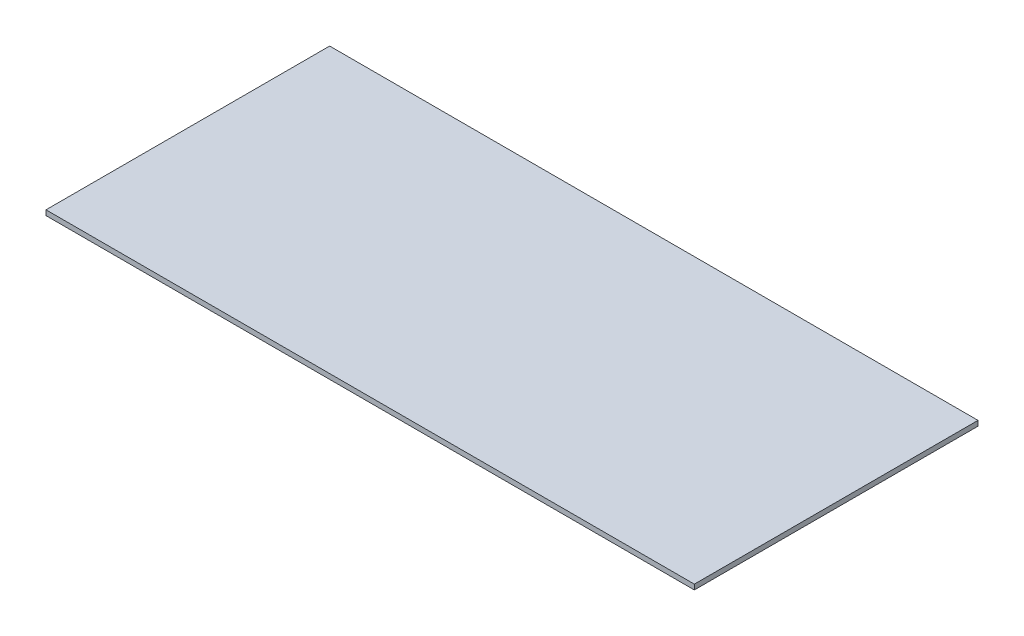
ISO-10303-21;
HEADER;
FILE_DESCRIPTION(('STEP AP214'),'2;1');
FILE_NAME('part.step','',(''),(''),'','','');
FILE_SCHEMA(('AUTOMOTIVE_DESIGN { 1 0 10303 214 1 1 1 1 }'));
ENDSEC;
DATA;
#1=APPLICATION_CONTEXT('core data for automotive mechanical design processes');
#2=APPLICATION_PROTOCOL_DEFINITION('international standard','automotive_design',2000,#1);
#3=PRODUCT_CONTEXT('',#1,'mechanical');
#4=PRODUCT('Part','Part','',(#3));
#5=PRODUCT_RELATED_PRODUCT_CATEGORY('part','',(#4));
#6=PRODUCT_DEFINITION_FORMATION('','',#4);
#7=PRODUCT_DEFINITION_CONTEXT('part definition',#1,'design');
#8=PRODUCT_DEFINITION('design','',#6,#7);
#9=PRODUCT_DEFINITION_SHAPE('','',#8);
#10=(LENGTH_UNIT() NAMED_UNIT(*) SI_UNIT(.MILLI.,.METRE.));
#11=(NAMED_UNIT(*) PLANE_ANGLE_UNIT() SI_UNIT($,.RADIAN.));
#12=(NAMED_UNIT(*) SI_UNIT($,.STERADIAN.) SOLID_ANGLE_UNIT());
#13=UNCERTAINTY_MEASURE_WITH_UNIT(LENGTH_MEASURE(1.E-05),#10,'distance_accuracy_value','');
#14=(GEOMETRIC_REPRESENTATION_CONTEXT(3) GLOBAL_UNCERTAINTY_ASSIGNED_CONTEXT((#13)) GLOBAL_UNIT_ASSIGNED_CONTEXT((#10,
#11,#12)) REPRESENTATION_CONTEXT('',''));
#15=CARTESIAN_POINT('',(0.,0.,0.));
#16=DIRECTION('',(0.,0.,1.));
#17=DIRECTION('',(1.,0.,0.));
#18=AXIS2_PLACEMENT_3D('',#15,#16,#17);
#19=CARTESIAN_POINT('',(101.6,1.5875,44.45));
#20=DIRECTION('',(-1.,0.,0.));
#21=DIRECTION('',(0.,0.,1.));
#22=AXIS2_PLACEMENT_3D('',#19,#20,#21);
#23=PLANE('',#22);
#24=DIRECTION('',(0.,0.,-1.));
#25=VECTOR('',#24,1.);
#26=CARTESIAN_POINT('',(101.6,0.,44.45));
#27=LINE('',#26,#25);
#28=CARTESIAN_POINT('',(101.6,0.,44.45));
#29=VERTEX_POINT('',#28);
#30=CARTESIAN_POINT('',(101.6,0.,-44.45));
#31=VERTEX_POINT('',#30);
#32=EDGE_CURVE('E128',#29,#31,#27,.T.);
#33=ORIENTED_EDGE('',*,*,#32,.T.);
#34=DIRECTION('',(0.,-1.,0.));
#35=VECTOR('',#34,1.);
#36=CARTESIAN_POINT('',(101.6,1.5875,-44.45));
#37=LINE('',#36,#35);
#38=CARTESIAN_POINT('',(101.6,1.5875,-44.45));
#39=VERTEX_POINT('',#38);
#40=EDGE_CURVE('E12',#39,#31,#37,.T.);
#41=ORIENTED_EDGE('',*,*,#40,.F.);
#42=DIRECTION('',(0.,0.,-1.));
#43=VECTOR('',#42,1.);
#44=CARTESIAN_POINT('',(101.6,1.5875,44.45));
#45=LINE('',#44,#43);
#46=CARTESIAN_POINT('',(101.6,1.5875,44.45));
#47=VERTEX_POINT('',#46);
#48=EDGE_CURVE('E92',#47,#39,#45,.T.);
#49=ORIENTED_EDGE('',*,*,#48,.F.);
#50=DIRECTION('',(0.,-1.,0.));
#51=VECTOR('',#50,1.);
#52=CARTESIAN_POINT('',(101.6,1.5875,44.45));
#53=LINE('',#52,#51);
#54=EDGE_CURVE('E104',#47,#29,#53,.T.);
#55=ORIENTED_EDGE('',*,*,#54,.T.);
#56=EDGE_LOOP('',(#33,#41,#49,#55));
#57=FACE_BOUND('',#56,.T.);
#58=ADVANCED_FACE('F40',(#57),#23,.F.);
#59=CARTESIAN_POINT('',(-101.6,1.5875,-44.45));
#60=DIRECTION('',(0.,0.,1.));
#61=DIRECTION('',(1.,0.,0.));
#62=AXIS2_PLACEMENT_3D('',#59,#60,#61);
#63=PLANE('',#62);
#64=DIRECTION('',(-1.,0.,0.));
#65=VECTOR('',#64,1.);
#66=CARTESIAN_POINT('',(-101.6,0.,-44.45));
#67=LINE('',#66,#65);
#68=CARTESIAN_POINT('',(-101.6,0.,-44.45));
#69=VERTEX_POINT('',#68);
#70=EDGE_CURVE('E97',#31,#69,#67,.T.);
#71=ORIENTED_EDGE('',*,*,#70,.T.);
#72=DIRECTION('',(0.,-1.,0.));
#73=VECTOR('',#72,1.);
#74=CARTESIAN_POINT('',(-101.6,1.5875,-44.45));
#75=LINE('',#74,#73);
#76=CARTESIAN_POINT('',(-101.6,1.5875,-44.45));
#77=VERTEX_POINT('',#76);
#78=EDGE_CURVE('E49',#77,#69,#75,.T.);
#79=ORIENTED_EDGE('',*,*,#78,.F.);
#80=DIRECTION('',(-1.,0.,0.));
#81=VECTOR('',#80,1.);
#82=CARTESIAN_POINT('',(-101.6,1.5875,-44.45));
#83=LINE('',#82,#81);
#84=EDGE_CURVE('E87',#39,#77,#83,.T.);
#85=ORIENTED_EDGE('',*,*,#84,.F.);
#86=ORIENTED_EDGE('',*,*,#40,.T.);
#87=EDGE_LOOP('',(#71,#79,#85,#86));
#88=FACE_BOUND('',#87,.T.);
#89=ADVANCED_FACE('F96',(#88),#63,.F.);
#90=CARTESIAN_POINT('',(-101.6,1.5875,44.45));
#91=DIRECTION('',(1.,0.,0.));
#92=DIRECTION('',(0.,0.,-1.));
#93=AXIS2_PLACEMENT_3D('',#90,#91,#92);
#94=PLANE('',#93);
#95=DIRECTION('',(0.,0.,1.));
#96=VECTOR('',#95,1.);
#97=CARTESIAN_POINT('',(-101.6,0.,44.45));
#98=LINE('',#97,#96);
#99=CARTESIAN_POINT('',(-101.6,0.,44.45));
#100=VERTEX_POINT('',#99);
#101=EDGE_CURVE('E74',#69,#100,#98,.T.);
#102=ORIENTED_EDGE('',*,*,#101,.T.);
#103=DIRECTION('',(0.,-1.,0.));
#104=VECTOR('',#103,1.);
#105=CARTESIAN_POINT('',(-101.6,1.5875,44.45));
#106=LINE('',#105,#104);
#107=CARTESIAN_POINT('',(-101.6,1.5875,44.45));
#108=VERTEX_POINT('',#107);
#109=EDGE_CURVE('E99',#108,#100,#106,.T.);
#110=ORIENTED_EDGE('',*,*,#109,.F.);
#111=DIRECTION('',(0.,0.,1.));
#112=VECTOR('',#111,1.);
#113=CARTESIAN_POINT('',(-101.6,1.5875,44.45));
#114=LINE('',#113,#112);
#115=EDGE_CURVE('E90',#77,#108,#114,.T.);
#116=ORIENTED_EDGE('',*,*,#115,.F.);
#117=ORIENTED_EDGE('',*,*,#78,.T.);
#118=EDGE_LOOP('',(#102,#110,#116,#117));
#119=FACE_BOUND('',#118,.T.);
#120=ADVANCED_FACE('F100',(#119),#94,.F.);
#121=CARTESIAN_POINT('',(-101.6,1.5875,44.45));
#122=DIRECTION('',(0.,0.,-1.));
#123=DIRECTION('',(-1.,0.,0.));
#124=AXIS2_PLACEMENT_3D('',#121,#122,#123);
#125=PLANE('',#124);
#126=DIRECTION('',(1.,0.,0.));
#127=VECTOR('',#126,1.);
#128=CARTESIAN_POINT('',(-101.6,0.,44.45));
#129=LINE('',#128,#127);
#130=EDGE_CURVE('E80',#100,#29,#129,.T.);
#131=ORIENTED_EDGE('',*,*,#130,.T.);
#132=ORIENTED_EDGE('',*,*,#54,.F.);
#133=DIRECTION('',(1.,0.,0.));
#134=VECTOR('',#133,1.);
#135=CARTESIAN_POINT('',(-101.6,1.5875,44.45));
#136=LINE('',#135,#134);
#137=EDGE_CURVE('E57',#108,#47,#136,.T.);
#138=ORIENTED_EDGE('',*,*,#137,.F.);
#139=ORIENTED_EDGE('',*,*,#109,.T.);
#140=EDGE_LOOP('',(#131,#132,#138,#139));
#141=FACE_BOUND('',#140,.T.);
#142=ADVANCED_FACE('F123',(#141),#125,.F.);
#143=CARTESIAN_POINT('',(0.,1.5875,0.));
#144=DIRECTION('',(0.,-1.,0.));
#145=DIRECTION('',(0.,0.,-1.));
#146=AXIS2_PLACEMENT_3D('',#143,#144,#145);
#147=PLANE('',#146);
#148=ORIENTED_EDGE('',*,*,#48,.T.);
#149=ORIENTED_EDGE('',*,*,#84,.T.);
#150=ORIENTED_EDGE('',*,*,#115,.T.);
#151=ORIENTED_EDGE('',*,*,#137,.T.);
#152=EDGE_LOOP('',(#148,#149,#150,#151));
#153=FACE_BOUND('',#152,.T.);
#154=ADVANCED_FACE('F88',(#153),#147,.F.);
#155=CARTESIAN_POINT('',(0.,0.,0.));
#156=DIRECTION('',(0.,-1.,0.));
#157=DIRECTION('',(0.,0.,-1.));
#158=AXIS2_PLACEMENT_3D('',#155,#156,#157);
#159=PLANE('',#158);
#160=ORIENTED_EDGE('',*,*,#32,.F.);
#161=ORIENTED_EDGE('',*,*,#130,.F.);
#162=ORIENTED_EDGE('',*,*,#101,.F.);
#163=ORIENTED_EDGE('',*,*,#70,.F.);
#164=EDGE_LOOP('',(#160,#161,#162,#163));
#165=FACE_BOUND('',#164,.T.);
#166=ADVANCED_FACE('F126',(#165),#159,.T.);
#167=CLOSED_SHELL('',(#58,#89,#120,#142,#154,#166));
#168=MANIFOLD_SOLID_BREP('B2',#167);
#169=ADVANCED_BREP_SHAPE_REPRESENTATION('',(#18,#168),#14);
#170=SHAPE_DEFINITION_REPRESENTATION(#9,#169);
ENDSEC;
END-ISO-10303-21;
